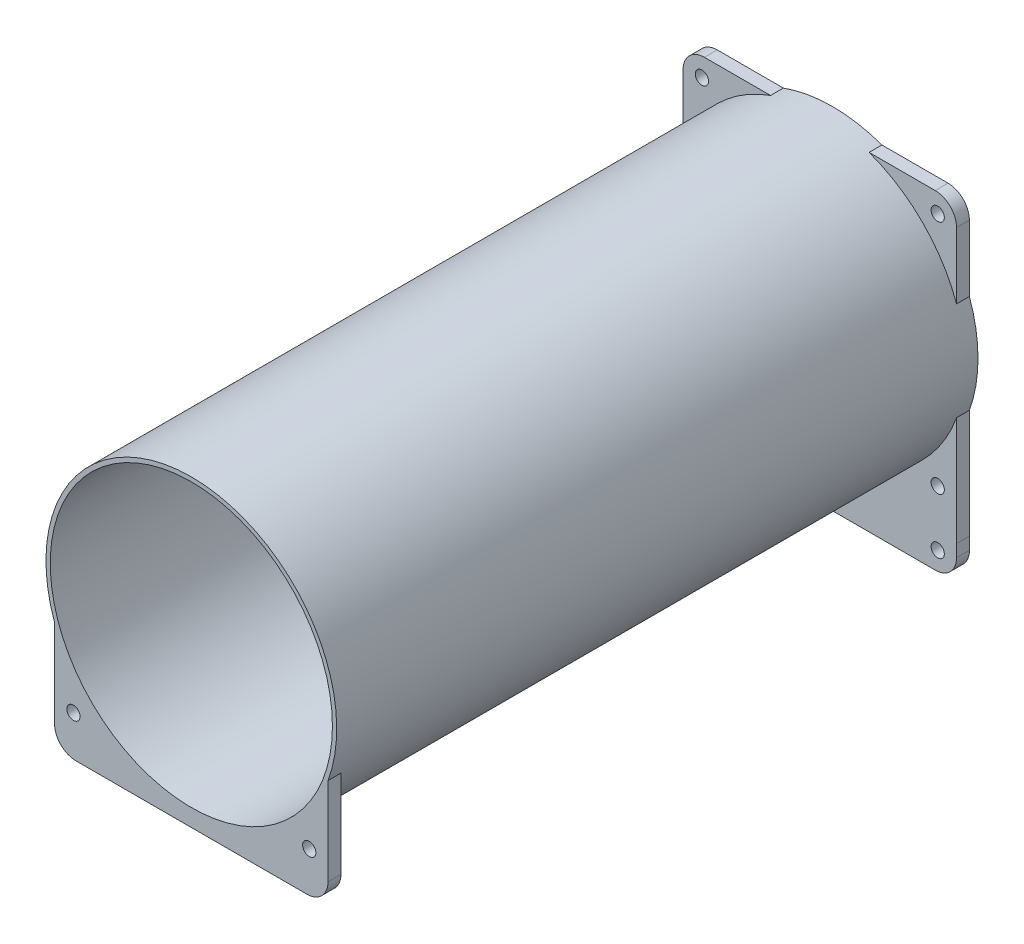
ISO-10303-21;
HEADER;
FILE_DESCRIPTION(('STEP AP214'),'2;1');
FILE_NAME('part.step','',(''),(''),'','','');
FILE_SCHEMA(('AUTOMOTIVE_DESIGN { 1 0 10303 214 1 1 1 1 }'));
ENDSEC;
DATA;
#1=APPLICATION_CONTEXT('core data for automotive mechanical design processes');
#2=APPLICATION_PROTOCOL_DEFINITION('international standard','automotive_design',2000,#1);
#3=PRODUCT_CONTEXT('',#1,'mechanical');
#4=PRODUCT('Part','Part','',(#3));
#5=PRODUCT_RELATED_PRODUCT_CATEGORY('part','',(#4));
#6=PRODUCT_DEFINITION_FORMATION('','',#4);
#7=PRODUCT_DEFINITION_CONTEXT('part definition',#1,'design');
#8=PRODUCT_DEFINITION('design','',#6,#7);
#9=PRODUCT_DEFINITION_SHAPE('','',#8);
#10=(LENGTH_UNIT() NAMED_UNIT(*) SI_UNIT(.MILLI.,.METRE.));
#11=(NAMED_UNIT(*) PLANE_ANGLE_UNIT() SI_UNIT($,.RADIAN.));
#12=(NAMED_UNIT(*) SI_UNIT($,.STERADIAN.) SOLID_ANGLE_UNIT());
#13=UNCERTAINTY_MEASURE_WITH_UNIT(LENGTH_MEASURE(1.E-05),#10,'distance_accuracy_value','');
#14=(GEOMETRIC_REPRESENTATION_CONTEXT(3) GLOBAL_UNCERTAINTY_ASSIGNED_CONTEXT((#13)) GLOBAL_UNIT_ASSIGNED_CONTEXT((#10,
#11,#12)) REPRESENTATION_CONTEXT('',''));
#15=CARTESIAN_POINT('',(0.,0.,0.));
#16=DIRECTION('',(0.,0.,1.));
#17=DIRECTION('',(1.,0.,0.));
#18=AXIS2_PLACEMENT_3D('',#15,#16,#17);
#19=CARTESIAN_POINT('',(0.,0.,53.));
#20=DIRECTION('',(0.,0.,1.));
#21=DIRECTION('',(1.,0.,0.));
#22=AXIS2_PLACEMENT_3D('',#19,#20,#21);
#23=PLANE('',#22);
#24=CARTESIAN_POINT('',(-27.5771644662754,5.92268552968515,53.));
#25=DIRECTION('',(0.,0.,1.));
#26=DIRECTION('',(1.,0.,0.));
#27=AXIS2_PLACEMENT_3D('',#24,#25,#26);
#28=CIRCLE('',#27,1.55);
#29=CARTESIAN_POINT('',(-26.0271644662754,5.92268552968515,53.));
#30=VERTEX_POINT('',#29);
#31=EDGE_CURVE('E426',#30,#30,#28,.T.);
#32=ORIENTED_EDGE('',*,*,#31,.F.);
#33=EDGE_LOOP('',(#32));
#34=FACE_BOUND('',#33,.T.);
#35=CARTESIAN_POINT('',(27.5771644662753,5.92268552968515,53.));
#36=DIRECTION('',(0.,0.,1.));
#37=DIRECTION('',(1.,0.,0.));
#38=AXIS2_PLACEMENT_3D('',#35,#36,#37);
#39=CIRCLE('',#38,1.55);
#40=CARTESIAN_POINT('',(29.1271644662753,5.92268552968515,53.));
#41=VERTEX_POINT('',#40);
#42=EDGE_CURVE('E513',#41,#41,#39,.T.);
#43=ORIENTED_EDGE('',*,*,#42,.F.);
#44=EDGE_LOOP('',(#43));
#45=FACE_BOUND('',#44,.T.);
#46=CARTESIAN_POINT('',(27.5771644662754,18.9226855296851,53.));
#47=DIRECTION('',(0.,0.,1.));
#48=DIRECTION('',(1.,0.,0.));
#49=AXIS2_PLACEMENT_3D('',#46,#47,#48);
#50=CIRCLE('',#49,1.55000000001874);
#51=CARTESIAN_POINT('',(29.1271644662941,18.9226855296851,53.));
#52=VERTEX_POINT('',#51);
#53=EDGE_CURVE('E511',#52,#52,#50,.F.);
#54=ORIENTED_EDGE('',*,*,#53,.T.);
#55=EDGE_LOOP('',(#54));
#56=FACE_BOUND('',#55,.T.);
#57=CARTESIAN_POINT('',(-27.5771644662754,18.9226855296851,53.));
#58=DIRECTION('',(0.,0.,1.));
#59=DIRECTION('',(1.,0.,0.));
#60=AXIS2_PLACEMENT_3D('',#57,#58,#59);
#61=CIRCLE('',#60,1.55000000001874);
#62=CARTESIAN_POINT('',(-26.0271644662566,18.9226855296851,53.));
#63=VERTEX_POINT('',#62);
#64=EDGE_CURVE('E448',#63,#63,#61,.T.);
#65=ORIENTED_EDGE('',*,*,#64,.F.);
#66=EDGE_LOOP('',(#65));
#67=FACE_BOUND('',#66,.T.);
#68=DIRECTION('',(0.,1.,0.));
#69=VECTOR('',#68,1.);
#70=CARTESIAN_POINT('',(31.9864677492385,0.,53.));
#71=LINE('',#70,#69);
#72=CARTESIAN_POINT('',(31.9864677492385,9.47000000000177,53.));
#73=VERTEX_POINT('',#72);
#74=CARTESIAN_POINT('',(31.9864677492387,34.9731036671784,53.));
#75=VERTEX_POINT('',#74);
#76=EDGE_CURVE('E509',#73,#75,#71,.T.);
#77=ORIENTED_EDGE('',*,*,#76,.T.);
#78=CARTESIAN_POINT('',(0.,46.4998499959605,53.));
#79=DIRECTION('',(0.,0.,1.));
#80=DIRECTION('',(1.,0.,0.));
#81=AXIS2_PLACEMENT_3D('',#78,#79,#80);
#82=CIRCLE('',#81,34.000000000018);
#83=CARTESIAN_POINT('',(-31.9864677492399,34.9731036671778,53.));
#84=VERTEX_POINT('',#83);
#85=EDGE_CURVE('E482',#75,#84,#82,.F.);
#86=ORIENTED_EDGE('',*,*,#85,.T.);
#87=DIRECTION('',(0.,-1.,0.));
#88=VECTOR('',#87,1.);
#89=CARTESIAN_POINT('',(-31.9864677492374,-2.22528973877618E-12,53.));
#90=LINE('',#89,#88);
#91=CARTESIAN_POINT('',(-31.9864677492388,9.47000000000005,53.));
#92=VERTEX_POINT('',#91);
#93=EDGE_CURVE('E491',#84,#92,#90,.T.);
#94=ORIENTED_EDGE('',*,*,#93,.T.);
#95=DIRECTION('',(-0.00171947023591037,-0.999998521709961,0.));
#96=VECTOR('',#95,1.);
#97=CARTESIAN_POINT('',(-32.0026565378179,0.0550276967337361,53.));
#98=LINE('',#97,#96);
#99=CARTESIAN_POINT('',(-31.9913878531997,6.60859735117958,53.));
#100=VERTEX_POINT('',#99);
#101=EDGE_CURVE('E494',#92,#100,#98,.T.);
#102=ORIENTED_EDGE('',*,*,#101,.T.);
#103=CARTESIAN_POINT('',(-26.9913952446499,6.59999999999999,53.));
#104=DIRECTION('',(0.,0.,1.));
#105=DIRECTION('',(1.,0.,0.));
#106=AXIS2_PLACEMENT_3D('',#103,#104,#105);
#107=CIRCLE('',#106,5.);
#108=CARTESIAN_POINT('',(-26.9913952446499,1.59999999999999,53.));
#109=VERTEX_POINT('',#108);
#110=EDGE_CURVE('E497',#100,#109,#107,.T.);
#111=ORIENTED_EDGE('',*,*,#110,.T.);
#112=DIRECTION('',(1.,0.,0.));
#113=VECTOR('',#112,1.);
#114=CARTESIAN_POINT('',(0.,1.59999999999999,53.));
#115=LINE('',#114,#113);
#116=CARTESIAN_POINT('',(26.9913952446497,1.6,53.));
#117=VERTEX_POINT('',#116);
#118=EDGE_CURVE('E500',#109,#117,#115,.T.);
#119=ORIENTED_EDGE('',*,*,#118,.T.);
#120=CARTESIAN_POINT('',(26.9913952446498,6.60000000000001,53.));
#121=DIRECTION('',(0.,0.,1.));
#122=DIRECTION('',(1.,0.,0.));
#123=AXIS2_PLACEMENT_3D('',#120,#121,#122);
#124=CIRCLE('',#123,5.);
#125=CARTESIAN_POINT('',(31.9913878531996,6.60859735117976,53.));
#126=VERTEX_POINT('',#125);
#127=EDGE_CURVE('E503',#117,#126,#124,.T.);
#128=ORIENTED_EDGE('',*,*,#127,.T.);
#129=DIRECTION('',(-0.00171947023594339,0.999998521709961,0.));
#130=VECTOR('',#129,1.);
#131=CARTESIAN_POINT('',(32.002656537818,0.0550276967347931,53.));
#132=LINE('',#131,#130);
#133=EDGE_CURVE('E506',#126,#73,#132,.T.);
#134=ORIENTED_EDGE('',*,*,#133,.T.);
#135=EDGE_LOOP('',(#77,#86,#94,#102,#111,#119,#128,#134));
#136=FACE_BOUND('',#135,.T.);
#137=ADVANCED_FACE('F168',(#34,#45,#56,#67,#136),#23,.T.);
#138=CARTESIAN_POINT('',(-27.5771644662754,74.0770144622359,53.));
#139=DIRECTION('',(0.,0.,1.));
#140=DIRECTION('',(1.,0.,0.));
#141=AXIS2_PLACEMENT_3D('',#138,#139,#140);
#142=CIRCLE('',#141,1.550000000018);
#143=CARTESIAN_POINT('',(-26.0271644662574,74.0770144622359,53.));
#144=VERTEX_POINT('',#143);
#145=EDGE_CURVE('E337',#144,#144,#142,.T.);
#146=ORIENTED_EDGE('',*,*,#145,.F.);
#147=EDGE_LOOP('',(#146));
#148=FACE_BOUND('',#147,.T.);
#149=DIRECTION('',(0.,-1.,0.));
#150=VECTOR('',#149,1.);
#151=CARTESIAN_POINT('',(-31.9864677492391,0.,53.));
#152=LINE('',#151,#150);
#153=CARTESIAN_POINT('',(-31.9864677492392,73.4863177451992,53.));
#154=VERTEX_POINT('',#153);
#155=CARTESIAN_POINT('',(-31.9864677492392,58.0265963247457,53.));
#156=VERTEX_POINT('',#155);
#157=EDGE_CURVE('E329',#154,#156,#152,.T.);
#158=ORIENTED_EDGE('',*,*,#157,.T.);
#159=CARTESIAN_POINT('',(-11.5267463287834,78.4863177451994,53.));
#160=VERTEX_POINT('',#159);
#161=EDGE_CURVE('E479',#156,#160,#82,.F.);
#162=ORIENTED_EDGE('',*,*,#161,.T.);
#163=DIRECTION('',(1.,0.,0.));
#164=VECTOR('',#163,1.);
#165=CARTESIAN_POINT('',(4.5091274135626E-12,78.4863177451988,53.));
#166=LINE('',#165,#164);
#167=CARTESIAN_POINT('',(-26.986467749238,78.4863177452003,53.));
#168=VERTEX_POINT('',#167);
#169=EDGE_CURVE('E469',#168,#160,#166,.T.);
#170=ORIENTED_EDGE('',*,*,#169,.F.);
#171=CARTESIAN_POINT('',(-26.9864677492379,73.4863177451994,53.));
#172=DIRECTION('',(0.,0.,1.));
#173=DIRECTION('',(1.,0.,0.));
#174=AXIS2_PLACEMENT_3D('',#171,#172,#173);
#175=CIRCLE('',#174,5.00000000000109);
#176=EDGE_CURVE('E471',#168,#154,#175,.T.);
#177=ORIENTED_EDGE('',*,*,#176,.T.);
#178=EDGE_LOOP('',(#158,#162,#170,#177));
#179=FACE_BOUND('',#178,.T.);
#180=ADVANCED_FACE('F377',(#148,#179),#23,.T.);
#181=CARTESIAN_POINT('',(27.5771644662754,74.0770144622359,53.));
#182=DIRECTION('',(0.,0.,1.));
#183=DIRECTION('',(1.,0.,0.));
#184=AXIS2_PLACEMENT_3D('',#181,#182,#183);
#185=CIRCLE('',#184,1.550000000018);
#186=CARTESIAN_POINT('',(29.1271644662934,74.0770144622359,53.));
#187=VERTEX_POINT('',#186);
#188=EDGE_CURVE('E286',#187,#187,#185,.F.);
#189=ORIENTED_EDGE('',*,*,#188,.T.);
#190=EDGE_LOOP('',(#189));
#191=FACE_BOUND('',#190,.T.);
#192=DIRECTION('',(1.,0.,0.));
#193=VECTOR('',#192,1.);
#194=CARTESIAN_POINT('',(1.76137789592298E-12,78.4863177451996,53.));
#195=LINE('',#194,#193);
#196=CARTESIAN_POINT('',(11.5267463287837,78.4863177451993,53.));
#197=VERTEX_POINT('',#196);
#198=CARTESIAN_POINT('',(26.9864677492376,78.486317745199,53.));
#199=VERTEX_POINT('',#198);
#200=EDGE_CURVE('E352',#197,#199,#195,.T.);
#201=ORIENTED_EDGE('',*,*,#200,.F.);
#202=CARTESIAN_POINT('',(31.986467749239,58.0265963247438,53.));
#203=VERTEX_POINT('',#202);
#204=EDGE_CURVE('E280',#197,#203,#82,.F.);
#205=ORIENTED_EDGE('',*,*,#204,.T.);
#206=DIRECTION('',(0.,-1.,0.));
#207=VECTOR('',#206,1.);
#208=CARTESIAN_POINT('',(31.9864677492407,9.61899435470919E-13,53.));
#209=LINE('',#208,#207);
#210=CARTESIAN_POINT('',(31.9864677492385,73.4863177451979,53.));
#211=VERTEX_POINT('',#210);
#212=EDGE_CURVE('E307',#211,#203,#209,.T.);
#213=ORIENTED_EDGE('',*,*,#212,.F.);
#214=CARTESIAN_POINT('',(26.986467749238,73.4863177451985,53.));
#215=DIRECTION('',(0.,0.,1.));
#216=DIRECTION('',(1.,0.,0.));
#217=AXIS2_PLACEMENT_3D('',#214,#215,#216);
#218=CIRCLE('',#217,5.00000000000053);
#219=EDGE_CURVE('E349',#199,#211,#218,.F.);
#220=ORIENTED_EDGE('',*,*,#219,.F.);
#221=EDGE_LOOP('',(#201,#205,#213,#220));
#222=FACE_BOUND('',#221,.T.);
#223=ADVANCED_FACE('F360',(#191,#222),#23,.T.);
#224=CARTESIAN_POINT('',(-27.5771644662754,5.92268552968515,53.));
#225=DIRECTION('',(0.,0.,-1.));
#226=DIRECTION('',(-1.,0.,0.));
#227=AXIS2_PLACEMENT_3D('',#224,#225,#226);
#228=CYLINDRICAL_SURFACE('',#227,1.55);
#229=ORIENTED_EDGE('',*,*,#31,.T.);
#230=EDGE_LOOP('',(#229));
#231=FACE_BOUND('',#230,.T.);
#232=CARTESIAN_POINT('',(-27.5771644662754,5.92268552968515,50.));
#233=DIRECTION('',(0.,0.,1.));
#234=DIRECTION('',(1.,0.,0.));
#235=AXIS2_PLACEMENT_3D('',#232,#233,#234);
#236=CIRCLE('',#235,1.55);
#237=CARTESIAN_POINT('',(-26.0271644662754,5.92268552968515,50.));
#238=VERTEX_POINT('',#237);
#239=EDGE_CURVE('E408',#238,#238,#236,.T.);
#240=ORIENTED_EDGE('',*,*,#239,.F.);
#241=EDGE_LOOP('',(#240));
#242=FACE_BOUND('',#241,.T.);
#243=ADVANCED_FACE('F389',(#231,#242),#228,.F.);
#244=CARTESIAN_POINT('',(27.5771644662753,5.92268552968515,53.));
#245=DIRECTION('',(0.,0.,-1.));
#246=DIRECTION('',(-1.,0.,0.));
#247=AXIS2_PLACEMENT_3D('',#244,#245,#246);
#248=CYLINDRICAL_SURFACE('',#247,1.55);
#249=ORIENTED_EDGE('',*,*,#42,.T.);
#250=EDGE_LOOP('',(#249));
#251=FACE_BOUND('',#250,.T.);
#252=CARTESIAN_POINT('',(27.5771644662753,5.92268552968515,50.));
#253=DIRECTION('',(0.,0.,1.));
#254=DIRECTION('',(1.,0.,0.));
#255=AXIS2_PLACEMENT_3D('',#252,#253,#254);
#256=CIRCLE('',#255,1.55);
#257=CARTESIAN_POINT('',(29.1271644662753,5.92268552968515,50.));
#258=VERTEX_POINT('',#257);
#259=EDGE_CURVE('E412',#258,#258,#256,.T.);
#260=ORIENTED_EDGE('',*,*,#259,.F.);
#261=EDGE_LOOP('',(#260));
#262=FACE_BOUND('',#261,.T.);
#263=ADVANCED_FACE('F394',(#251,#262),#248,.F.);
#264=CARTESIAN_POINT('',(27.5771644662754,18.9226855296851,53.));
#265=DIRECTION('',(0.,0.,-1.));
#266=DIRECTION('',(-1.,0.,0.));
#267=AXIS2_PLACEMENT_3D('',#264,#265,#266);
#268=CYLINDRICAL_SURFACE('',#267,1.55000000001874);
#269=ORIENTED_EDGE('',*,*,#53,.F.);
#270=EDGE_LOOP('',(#269));
#271=FACE_BOUND('',#270,.T.);
#272=CARTESIAN_POINT('',(27.5771644662754,18.9226855296851,50.));
#273=DIRECTION('',(0.,0.,1.));
#274=DIRECTION('',(1.,0.,0.));
#275=AXIS2_PLACEMENT_3D('',#272,#273,#274);
#276=CIRCLE('',#275,1.55000000001874);
#277=CARTESIAN_POINT('',(29.1271644662941,18.9226855296851,50.));
#278=VERTEX_POINT('',#277);
#279=EDGE_CURVE('E416',#278,#278,#276,.F.);
#280=ORIENTED_EDGE('',*,*,#279,.T.);
#281=EDGE_LOOP('',(#280));
#282=FACE_BOUND('',#281,.T.);
#283=ADVANCED_FACE('F567',(#271,#282),#268,.F.);
#284=CARTESIAN_POINT('',(-31.9864677492374,-2.22528973877618E-12,53.));
#285=DIRECTION('',(1.,0.,0.));
#286=DIRECTION('',(0.,1.,0.));
#287=AXIS2_PLACEMENT_3D('',#284,#285,#286);
#288=PLANE('',#287);
#289=DIRECTION('',(0.,-1.,0.));
#290=VECTOR('',#289,1.);
#291=CARTESIAN_POINT('',(-31.9864677492374,-2.22528973877618E-12,50.));
#292=LINE('',#291,#290);
#293=CARTESIAN_POINT('',(-31.9864677492399,34.9731036671778,50.));
#294=VERTEX_POINT('',#293);
#295=CARTESIAN_POINT('',(-31.9864677492388,9.47000000000005,50.));
#296=VERTEX_POINT('',#295);
#297=EDGE_CURVE('E420',#294,#296,#292,.T.);
#298=ORIENTED_EDGE('',*,*,#297,.T.);
#299=DIRECTION('',(0.,0.,-1.));
#300=VECTOR('',#299,1.);
#301=CARTESIAN_POINT('',(-31.9864677492388,9.47000000000005,53.));
#302=LINE('',#301,#300);
#303=EDGE_CURVE('E177',#92,#296,#302,.T.);
#304=ORIENTED_EDGE('',*,*,#303,.F.);
#305=ORIENTED_EDGE('',*,*,#93,.F.);
#306=DIRECTION('',(0.,0.,-1.));
#307=VECTOR('',#306,1.);
#308=CARTESIAN_POINT('',(-31.9864677492399,34.9731036671778,53.));
#309=LINE('',#308,#307);
#310=EDGE_CURVE('E12',#84,#294,#309,.T.);
#311=ORIENTED_EDGE('',*,*,#310,.T.);
#312=EDGE_LOOP('',(#298,#304,#305,#311));
#313=FACE_BOUND('',#312,.T.);
#314=ADVANCED_FACE('F535',(#313),#288,.F.);
#315=CARTESIAN_POINT('',(-32.0026565378179,0.0550276967337361,53.));
#316=DIRECTION('',(0.999998521709961,-0.00171947023591036,0.));
#317=DIRECTION('',(0.00171947023591037,0.999998521709961,0.));
#318=AXIS2_PLACEMENT_3D('',#315,#316,#317);
#319=PLANE('',#318);
#320=DIRECTION('',(-0.00171947023591037,-0.999998521709961,0.));
#321=VECTOR('',#320,1.);
#322=CARTESIAN_POINT('',(-32.0026565378179,0.0550276967337361,50.));
#323=LINE('',#322,#321);
#324=CARTESIAN_POINT('',(-31.9913878531997,6.60859735117958,50.));
#325=VERTEX_POINT('',#324);
#326=EDGE_CURVE('E423',#296,#325,#323,.T.);
#327=ORIENTED_EDGE('',*,*,#326,.T.);
#328=DIRECTION('',(0.,0.,-1.));
#329=VECTOR('',#328,1.);
#330=CARTESIAN_POINT('',(-31.9913878531997,6.60859735117958,53.));
#331=LINE('',#330,#329);
#332=EDGE_CURVE('E462',#100,#325,#331,.T.);
#333=ORIENTED_EDGE('',*,*,#332,.F.);
#334=ORIENTED_EDGE('',*,*,#101,.F.);
#335=ORIENTED_EDGE('',*,*,#303,.T.);
#336=EDGE_LOOP('',(#327,#333,#334,#335));
#337=FACE_BOUND('',#336,.T.);
#338=ADVANCED_FACE('F579',(#337),#319,.F.);
#339=CARTESIAN_POINT('',(-26.9913952446499,6.59999999999999,53.));
#340=DIRECTION('',(0.,0.,-1.));
#341=DIRECTION('',(-1.,0.,0.));
#342=AXIS2_PLACEMENT_3D('',#339,#340,#341);
#343=CYLINDRICAL_SURFACE('',#342,5.);
#344=CARTESIAN_POINT('',(-26.9913952446499,6.59999999999999,50.));
#345=DIRECTION('',(0.,0.,1.));
#346=DIRECTION('',(1.,0.,0.));
#347=AXIS2_PLACEMENT_3D('',#344,#345,#346);
#348=CIRCLE('',#347,5.);
#349=CARTESIAN_POINT('',(-26.9913952446499,1.59999999999999,50.));
#350=VERTEX_POINT('',#349);
#351=EDGE_CURVE('E431',#325,#350,#348,.T.);
#352=ORIENTED_EDGE('',*,*,#351,.T.);
#353=DIRECTION('',(0.,0.,-1.));
#354=VECTOR('',#353,1.);
#355=CARTESIAN_POINT('',(-26.9913952446499,1.59999999999999,53.));
#356=LINE('',#355,#354);
#357=EDGE_CURVE('E459',#109,#350,#356,.T.);
#358=ORIENTED_EDGE('',*,*,#357,.F.);
#359=ORIENTED_EDGE('',*,*,#110,.F.);
#360=ORIENTED_EDGE('',*,*,#332,.T.);
#361=EDGE_LOOP('',(#352,#358,#359,#360));
#362=FACE_BOUND('',#361,.T.);
#363=ADVANCED_FACE('F575',(#362),#343,.T.);
#364=CARTESIAN_POINT('',(0.,1.59999999999999,53.));
#365=DIRECTION('',(0.,1.,0.));
#366=DIRECTION('',(-1.,0.,0.));
#367=AXIS2_PLACEMENT_3D('',#364,#365,#366);
#368=PLANE('',#367);
#369=DIRECTION('',(1.,0.,0.));
#370=VECTOR('',#369,1.);
#371=CARTESIAN_POINT('',(0.,1.59999999999999,50.));
#372=LINE('',#371,#370);
#373=CARTESIAN_POINT('',(26.9913952446497,1.6,50.));
#374=VERTEX_POINT('',#373);
#375=EDGE_CURVE('E434',#350,#374,#372,.T.);
#376=ORIENTED_EDGE('',*,*,#375,.T.);
#377=DIRECTION('',(0.,0.,-1.));
#378=VECTOR('',#377,1.);
#379=CARTESIAN_POINT('',(26.9913952446497,1.6,53.));
#380=LINE('',#379,#378);
#381=EDGE_CURVE('E456',#117,#374,#380,.T.);
#382=ORIENTED_EDGE('',*,*,#381,.F.);
#383=ORIENTED_EDGE('',*,*,#118,.F.);
#384=ORIENTED_EDGE('',*,*,#357,.T.);
#385=EDGE_LOOP('',(#376,#382,#383,#384));
#386=FACE_BOUND('',#385,.T.);
#387=ADVANCED_FACE('F572',(#386),#368,.F.);
#388=CARTESIAN_POINT('',(26.9913952446498,6.60000000000001,53.));
#389=DIRECTION('',(0.,0.,-1.));
#390=DIRECTION('',(-1.,0.,0.));
#391=AXIS2_PLACEMENT_3D('',#388,#389,#390);
#392=CYLINDRICAL_SURFACE('',#391,5.);
#393=CARTESIAN_POINT('',(26.9913952446498,6.60000000000001,50.));
#394=DIRECTION('',(0.,0.,1.));
#395=DIRECTION('',(1.,0.,0.));
#396=AXIS2_PLACEMENT_3D('',#393,#394,#395);
#397=CIRCLE('',#396,5.);
#398=CARTESIAN_POINT('',(31.9913878531996,6.60859735117976,50.));
#399=VERTEX_POINT('',#398);
#400=EDGE_CURVE('E437',#374,#399,#397,.T.);
#401=ORIENTED_EDGE('',*,*,#400,.T.);
#402=DIRECTION('',(0.,0.,-1.));
#403=VECTOR('',#402,1.);
#404=CARTESIAN_POINT('',(31.9913878531996,6.60859735117976,53.));
#405=LINE('',#404,#403);
#406=EDGE_CURVE('E453',#126,#399,#405,.T.);
#407=ORIENTED_EDGE('',*,*,#406,.F.);
#408=ORIENTED_EDGE('',*,*,#127,.F.);
#409=ORIENTED_EDGE('',*,*,#381,.T.);
#410=EDGE_LOOP('',(#401,#407,#408,#409));
#411=FACE_BOUND('',#410,.T.);
#412=ADVANCED_FACE('F555',(#411),#392,.T.);
#413=CARTESIAN_POINT('',(32.002656537818,0.0550276967347931,53.));
#414=DIRECTION('',(-0.999998521709961,-0.00171947023594339,0.));
#415=DIRECTION('',(0.00171947023594339,-0.999998521709961,0.));
#416=AXIS2_PLACEMENT_3D('',#413,#414,#415);
#417=PLANE('',#416);
#418=DIRECTION('',(-0.00171947023594339,0.999998521709961,0.));
#419=VECTOR('',#418,1.);
#420=CARTESIAN_POINT('',(32.002656537818,0.0550276967347931,50.));
#421=LINE('',#420,#419);
#422=CARTESIAN_POINT('',(31.9864677492385,9.47000000000177,50.));
#423=VERTEX_POINT('',#422);
#424=EDGE_CURVE('E440',#399,#423,#421,.T.);
#425=ORIENTED_EDGE('',*,*,#424,.T.);
#426=DIRECTION('',(0.,0.,-1.));
#427=VECTOR('',#426,1.);
#428=CARTESIAN_POINT('',(31.9864677492385,9.47000000000177,53.));
#429=LINE('',#428,#427);
#430=EDGE_CURVE('E450',#73,#423,#429,.T.);
#431=ORIENTED_EDGE('',*,*,#430,.F.);
#432=ORIENTED_EDGE('',*,*,#133,.F.);
#433=ORIENTED_EDGE('',*,*,#406,.T.);
#434=EDGE_LOOP('',(#425,#431,#432,#433));
#435=FACE_BOUND('',#434,.T.);
#436=ADVANCED_FACE('F551',(#435),#417,.F.);
#437=CARTESIAN_POINT('',(31.9864677492385,0.,53.));
#438=DIRECTION('',(-1.,0.,0.));
#439=DIRECTION('',(0.,0.,1.));
#440=AXIS2_PLACEMENT_3D('',#437,#438,#439);
#441=PLANE('',#440);
#442=DIRECTION('',(0.,1.,0.));
#443=VECTOR('',#442,1.);
#444=CARTESIAN_POINT('',(31.9864677492385,0.,50.));
#445=LINE('',#444,#443);
#446=CARTESIAN_POINT('',(31.9864677492387,34.9731036671784,50.));
#447=VERTEX_POINT('',#446);
#448=EDGE_CURVE('E443',#423,#447,#445,.T.);
#449=ORIENTED_EDGE('',*,*,#448,.T.);
#450=DIRECTION('',(0.,0.,-1.));
#451=VECTOR('',#450,1.);
#452=CARTESIAN_POINT('',(31.9864677492387,34.9731036671784,53.));
#453=LINE('',#452,#451);
#454=EDGE_CURVE('E194',#75,#447,#453,.T.);
#455=ORIENTED_EDGE('',*,*,#454,.F.);
#456=ORIENTED_EDGE('',*,*,#76,.F.);
#457=ORIENTED_EDGE('',*,*,#430,.T.);
#458=EDGE_LOOP('',(#449,#455,#456,#457));
#459=FACE_BOUND('',#458,.T.);
#460=ADVANCED_FACE('F556',(#459),#441,.F.);
#461=CARTESIAN_POINT('',(-27.5771644662754,18.9226855296851,53.));
#462=DIRECTION('',(0.,0.,-1.));
#463=DIRECTION('',(-1.,0.,0.));
#464=AXIS2_PLACEMENT_3D('',#461,#462,#463);
#465=CYLINDRICAL_SURFACE('',#464,1.55000000001874);
#466=ORIENTED_EDGE('',*,*,#64,.T.);
#467=EDGE_LOOP('',(#466));
#468=FACE_BOUND('',#467,.T.);
#469=CARTESIAN_POINT('',(-27.5771644662754,18.9226855296851,50.));
#470=DIRECTION('',(0.,0.,1.));
#471=DIRECTION('',(1.,0.,0.));
#472=AXIS2_PLACEMENT_3D('',#469,#470,#471);
#473=CIRCLE('',#472,1.55000000001874);
#474=CARTESIAN_POINT('',(-26.0271644662566,18.9226855296851,50.));
#475=VERTEX_POINT('',#474);
#476=EDGE_CURVE('E347',#475,#475,#473,.T.);
#477=ORIENTED_EDGE('',*,*,#476,.F.);
#478=EDGE_LOOP('',(#477));
#479=FACE_BOUND('',#478,.T.);
#480=ADVANCED_FACE('F403',(#468,#479),#465,.F.);
#481=CARTESIAN_POINT('',(0.,0.,50.));
#482=DIRECTION('',(0.,0.,1.));
#483=DIRECTION('',(1.,0.,0.));
#484=AXIS2_PLACEMENT_3D('',#481,#482,#483);
#485=PLANE('',#484);
#486=CARTESIAN_POINT('',(0.,46.4998499959605,50.));
#487=DIRECTION('',(0.,0.,1.));
#488=DIRECTION('',(1.,0.,0.));
#489=AXIS2_PLACEMENT_3D('',#486,#487,#488);
#490=CIRCLE('',#489,34.000000000018);
#491=CARTESIAN_POINT('',(31.986467749239,58.0265963247432,50.));
#492=VERTEX_POINT('',#491);
#493=EDGE_CURVE('E300',#447,#492,#490,.T.);
#494=ORIENTED_EDGE('',*,*,#493,.F.);
#495=ORIENTED_EDGE('',*,*,#448,.F.);
#496=ORIENTED_EDGE('',*,*,#424,.F.);
#497=ORIENTED_EDGE('',*,*,#400,.F.);
#498=ORIENTED_EDGE('',*,*,#375,.F.);
#499=ORIENTED_EDGE('',*,*,#351,.F.);
#500=ORIENTED_EDGE('',*,*,#326,.F.);
#501=ORIENTED_EDGE('',*,*,#297,.F.);
#502=CARTESIAN_POINT('',(-31.9864677492392,58.0265963247457,50.));
#503=VERTEX_POINT('',#502);
#504=EDGE_CURVE('E299',#503,#294,#490,.T.);
#505=ORIENTED_EDGE('',*,*,#504,.F.);
#506=DIRECTION('',(0.,-1.,0.));
#507=VECTOR('',#506,1.);
#508=CARTESIAN_POINT('',(-31.9864677492391,0.,50.));
#509=LINE('',#508,#507);
#510=CARTESIAN_POINT('',(-31.9864677492392,73.4863177451992,50.));
#511=VERTEX_POINT('',#510);
#512=EDGE_CURVE('E334',#511,#503,#509,.T.);
#513=ORIENTED_EDGE('',*,*,#512,.F.);
#514=CARTESIAN_POINT('',(-26.9864677492379,73.4863177451994,50.));
#515=DIRECTION('',(0.,0.,1.));
#516=DIRECTION('',(1.,0.,0.));
#517=AXIS2_PLACEMENT_3D('',#514,#515,#516);
#518=CIRCLE('',#517,5.00000000000109);
#519=CARTESIAN_POINT('',(-26.986467749238,78.4863177452003,50.));
#520=VERTEX_POINT('',#519);
#521=EDGE_CURVE('E326',#520,#511,#518,.T.);
#522=ORIENTED_EDGE('',*,*,#521,.F.);
#523=DIRECTION('',(1.,0.,0.));
#524=VECTOR('',#523,1.);
#525=CARTESIAN_POINT('',(4.5091274135626E-12,78.4863177451988,50.));
#526=LINE('',#525,#524);
#527=CARTESIAN_POINT('',(-11.5267463287834,78.4863177451994,50.));
#528=VERTEX_POINT('',#527);
#529=EDGE_CURVE('E297',#520,#528,#526,.T.);
#530=ORIENTED_EDGE('',*,*,#529,.T.);
#531=CARTESIAN_POINT('',(11.5267463287837,78.4863177451993,50.));
#532=VERTEX_POINT('',#531);
#533=EDGE_CURVE('E276',#532,#528,#490,.T.);
#534=ORIENTED_EDGE('',*,*,#533,.F.);
#535=DIRECTION('',(1.,0.,0.));
#536=VECTOR('',#535,1.);
#537=CARTESIAN_POINT('',(1.76137789592298E-12,78.4863177451996,50.));
#538=LINE('',#537,#536);
#539=CARTESIAN_POINT('',(26.9864677492376,78.486317745199,50.));
#540=VERTEX_POINT('',#539);
#541=EDGE_CURVE('E294',#532,#540,#538,.T.);
#542=ORIENTED_EDGE('',*,*,#541,.T.);
#543=CARTESIAN_POINT('',(26.986467749238,73.4863177451985,50.));
#544=DIRECTION('',(0.,0.,1.));
#545=DIRECTION('',(1.,0.,0.));
#546=AXIS2_PLACEMENT_3D('',#543,#544,#545);
#547=CIRCLE('',#546,5.00000000000053);
#548=CARTESIAN_POINT('',(31.9864677492385,73.4863177451979,50.));
#549=VERTEX_POINT('',#548);
#550=EDGE_CURVE('E304',#540,#549,#547,.F.);
#551=ORIENTED_EDGE('',*,*,#550,.T.);
#552=DIRECTION('',(0.,-1.,0.));
#553=VECTOR('',#552,1.);
#554=CARTESIAN_POINT('',(31.9864677492407,9.61899435470919E-13,50.));
#555=LINE('',#554,#553);
#556=EDGE_CURVE('E298',#549,#492,#555,.T.);
#557=ORIENTED_EDGE('',*,*,#556,.T.);
#558=EDGE_LOOP('',(#494,#495,#496,#497,#498,#499,#500,#501,#505,#513,#522,#530,#534,#542,#551,#557));
#559=FACE_BOUND('',#558,.T.);
#560=CARTESIAN_POINT('',(0.,46.4998499959605,50.));
#561=DIRECTION('',(0.,0.,1.));
#562=DIRECTION('',(1.,0.,0.));
#563=AXIS2_PLACEMENT_3D('',#560,#561,#562);
#564=CIRCLE('',#563,33.000000000018);
#565=CARTESIAN_POINT('',(33.000000000018,46.4998499959605,50.));
#566=VERTEX_POINT('',#565);
#567=EDGE_CURVE('E172',#566,#566,#564,.T.);
#568=ORIENTED_EDGE('',*,*,#567,.T.);
#569=EDGE_LOOP('',(#568));
#570=FACE_BOUND('',#569,.T.);
#571=CARTESIAN_POINT('',(27.5771644662754,74.0770144622359,50.));
#572=DIRECTION('',(0.,0.,1.));
#573=DIRECTION('',(1.,0.,0.));
#574=AXIS2_PLACEMENT_3D('',#571,#572,#573);
#575=CIRCLE('',#574,1.550000000018);
#576=CARTESIAN_POINT('',(29.1271644662934,74.0770144622359,50.));
#577=VERTEX_POINT('',#576);
#578=EDGE_CURVE('E303',#577,#577,#575,.F.);
#579=ORIENTED_EDGE('',*,*,#578,.F.);
#580=EDGE_LOOP('',(#579));
#581=FACE_BOUND('',#580,.T.);
#582=CARTESIAN_POINT('',(-27.5771644662754,74.0770144622359,50.));
#583=DIRECTION('',(0.,0.,1.));
#584=DIRECTION('',(1.,0.,0.));
#585=AXIS2_PLACEMENT_3D('',#582,#583,#584);
#586=CIRCLE('',#585,1.550000000018);
#587=CARTESIAN_POINT('',(-26.0271644662574,74.0770144622359,50.));
#588=VERTEX_POINT('',#587);
#589=EDGE_CURVE('E317',#588,#588,#586,.T.);
#590=ORIENTED_EDGE('',*,*,#589,.T.);
#591=EDGE_LOOP('',(#590));
#592=FACE_BOUND('',#591,.T.);
#593=ORIENTED_EDGE('',*,*,#239,.T.);
#594=EDGE_LOOP('',(#593));
#595=FACE_BOUND('',#594,.T.);
#596=ORIENTED_EDGE('',*,*,#259,.T.);
#597=EDGE_LOOP('',(#596));
#598=FACE_BOUND('',#597,.T.);
#599=ORIENTED_EDGE('',*,*,#279,.F.);
#600=EDGE_LOOP('',(#599));
#601=FACE_BOUND('',#600,.T.);
#602=ORIENTED_EDGE('',*,*,#476,.T.);
#603=EDGE_LOOP('',(#602));
#604=FACE_BOUND('',#603,.T.);
#605=ADVANCED_FACE('F291',(#559,#570,#581,#592,#595,#598,#601,#604),#485,.F.);
#606=CARTESIAN_POINT('',(4.5091274135626E-12,78.4863177451988,53.));
#607=DIRECTION('',(0.,1.,0.));
#608=DIRECTION('',(-1.,0.,0.));
#609=AXIS2_PLACEMENT_3D('',#606,#607,#608);
#610=PLANE('',#609);
#611=ORIENTED_EDGE('',*,*,#529,.F.);
#612=DIRECTION('',(0.,0.,-1.));
#613=VECTOR('',#612,1.);
#614=CARTESIAN_POINT('',(-26.986467749238,78.4863177452003,53.));
#615=LINE('',#614,#613);
#616=EDGE_CURVE('E343',#168,#520,#615,.T.);
#617=ORIENTED_EDGE('',*,*,#616,.F.);
#618=ORIENTED_EDGE('',*,*,#169,.T.);
#619=DIRECTION('',(0.,0.,-1.));
#620=VECTOR('',#619,1.);
#621=CARTESIAN_POINT('',(-11.5267463287834,78.4863177451994,53.));
#622=LINE('',#621,#620);
#623=EDGE_CURVE('E345',#160,#528,#622,.T.);
#624=ORIENTED_EDGE('',*,*,#623,.T.);
#625=EDGE_LOOP('',(#611,#617,#618,#624));
#626=FACE_BOUND('',#625,.T.);
#627=ADVANCED_FACE('F402',(#626),#610,.T.);
#628=CARTESIAN_POINT('',(-26.9864677492379,73.4863177451994,53.));
#629=DIRECTION('',(0.,0.,-1.));
#630=DIRECTION('',(-1.,0.,0.));
#631=AXIS2_PLACEMENT_3D('',#628,#629,#630);
#632=CYLINDRICAL_SURFACE('',#631,5.00000000000109);
#633=ORIENTED_EDGE('',*,*,#521,.T.);
#634=DIRECTION('',(0.,0.,-1.));
#635=VECTOR('',#634,1.);
#636=CARTESIAN_POINT('',(-31.9864677492392,73.4863177451992,53.));
#637=LINE('',#636,#635);
#638=EDGE_CURVE('E340',#154,#511,#637,.T.);
#639=ORIENTED_EDGE('',*,*,#638,.F.);
#640=ORIENTED_EDGE('',*,*,#176,.F.);
#641=ORIENTED_EDGE('',*,*,#616,.T.);
#642=EDGE_LOOP('',(#633,#639,#640,#641));
#643=FACE_BOUND('',#642,.T.);
#644=ADVANCED_FACE('F587',(#643),#632,.T.);
#645=CARTESIAN_POINT('',(-27.5771644662754,74.0770144622359,53.));
#646=DIRECTION('',(0.,0.,-1.));
#647=DIRECTION('',(-1.,0.,0.));
#648=AXIS2_PLACEMENT_3D('',#645,#646,#647);
#649=CYLINDRICAL_SURFACE('',#648,1.550000000018);
#650=ORIENTED_EDGE('',*,*,#145,.T.);
#651=EDGE_LOOP('',(#650));
#652=FACE_BOUND('',#651,.T.);
#653=ORIENTED_EDGE('',*,*,#589,.F.);
#654=EDGE_LOOP('',(#653));
#655=FACE_BOUND('',#654,.T.);
#656=ADVANCED_FACE('F371',(#652,#655),#649,.F.);
#657=CARTESIAN_POINT('',(27.5771644662754,74.0770144622359,53.));
#658=DIRECTION('',(0.,0.,-1.));
#659=DIRECTION('',(-1.,0.,0.));
#660=AXIS2_PLACEMENT_3D('',#657,#658,#659);
#661=CYLINDRICAL_SURFACE('',#660,1.550000000018);
#662=ORIENTED_EDGE('',*,*,#188,.F.);
#663=EDGE_LOOP('',(#662));
#664=FACE_BOUND('',#663,.T.);
#665=ORIENTED_EDGE('',*,*,#578,.T.);
#666=EDGE_LOOP('',(#665));
#667=FACE_BOUND('',#666,.T.);
#668=ADVANCED_FACE('F363',(#664,#667),#661,.F.);
#669=CARTESIAN_POINT('',(26.986467749238,73.4863177451985,53.));
#670=DIRECTION('',(0.,0.,-1.));
#671=DIRECTION('',(-1.,0.,0.));
#672=AXIS2_PLACEMENT_3D('',#669,#670,#671);
#673=CYLINDRICAL_SURFACE('',#672,5.00000000000053);
#674=ORIENTED_EDGE('',*,*,#550,.F.);
#675=DIRECTION('',(0.,0.,-1.));
#676=VECTOR('',#675,1.);
#677=CARTESIAN_POINT('',(26.9864677492376,78.486317745199,53.));
#678=LINE('',#677,#676);
#679=EDGE_CURVE('E285',#199,#540,#678,.T.);
#680=ORIENTED_EDGE('',*,*,#679,.F.);
#681=ORIENTED_EDGE('',*,*,#219,.T.);
#682=DIRECTION('',(0.,0.,-1.));
#683=VECTOR('',#682,1.);
#684=CARTESIAN_POINT('',(31.9864677492385,73.4863177451979,53.));
#685=LINE('',#684,#683);
#686=EDGE_CURVE('E313',#211,#549,#685,.T.);
#687=ORIENTED_EDGE('',*,*,#686,.T.);
#688=EDGE_LOOP('',(#674,#680,#681,#687));
#689=FACE_BOUND('',#688,.T.);
#690=ADVANCED_FACE('F361',(#689),#673,.T.);
#691=CARTESIAN_POINT('',(1.76137789592298E-12,78.4863177451996,53.));
#692=DIRECTION('',(0.,1.,0.));
#693=DIRECTION('',(-1.,0.,0.));
#694=AXIS2_PLACEMENT_3D('',#691,#692,#693);
#695=PLANE('',#694);
#696=ORIENTED_EDGE('',*,*,#541,.F.);
#697=DIRECTION('',(0.,0.,-1.));
#698=VECTOR('',#697,1.);
#699=CARTESIAN_POINT('',(11.5267463287837,78.4863177451993,53.));
#700=LINE('',#699,#698);
#701=EDGE_CURVE('E270',#197,#532,#700,.T.);
#702=ORIENTED_EDGE('',*,*,#701,.F.);
#703=ORIENTED_EDGE('',*,*,#200,.T.);
#704=ORIENTED_EDGE('',*,*,#679,.T.);
#705=EDGE_LOOP('',(#696,#702,#703,#704));
#706=FACE_BOUND('',#705,.T.);
#707=ADVANCED_FACE('F301',(#706),#695,.T.);
#708=CARTESIAN_POINT('',(-31.9864677492391,0.,53.));
#709=DIRECTION('',(1.,0.,0.));
#710=DIRECTION('',(0.,1.,0.));
#711=AXIS2_PLACEMENT_3D('',#708,#709,#710);
#712=PLANE('',#711);
#713=ORIENTED_EDGE('',*,*,#512,.T.);
#714=DIRECTION('',(0.,0.,-1.));
#715=VECTOR('',#714,1.);
#716=CARTESIAN_POINT('',(-31.9864677492392,58.0265963247457,53.));
#717=LINE('',#716,#715);
#718=EDGE_CURVE('E338',#156,#503,#717,.T.);
#719=ORIENTED_EDGE('',*,*,#718,.F.);
#720=ORIENTED_EDGE('',*,*,#157,.F.);
#721=ORIENTED_EDGE('',*,*,#638,.T.);
#722=EDGE_LOOP('',(#713,#719,#720,#721));
#723=FACE_BOUND('',#722,.T.);
#724=ADVANCED_FACE('F369',(#723),#712,.F.);
#725=CARTESIAN_POINT('',(31.9864677492407,9.61899435470919E-13,53.));
#726=DIRECTION('',(1.,0.,0.));
#727=DIRECTION('',(0.,1.,0.));
#728=AXIS2_PLACEMENT_3D('',#725,#726,#727);
#729=PLANE('',#728);
#730=ORIENTED_EDGE('',*,*,#556,.F.);
#731=ORIENTED_EDGE('',*,*,#686,.F.);
#732=ORIENTED_EDGE('',*,*,#212,.T.);
#733=DIRECTION('',(0.,0.,-1.));
#734=VECTOR('',#733,1.);
#735=CARTESIAN_POINT('',(31.986467749239,58.0265963247432,53.));
#736=LINE('',#735,#734);
#737=EDGE_CURVE('E315',#203,#492,#736,.T.);
#738=ORIENTED_EDGE('',*,*,#737,.T.);
#739=EDGE_LOOP('',(#730,#731,#732,#738));
#740=FACE_BOUND('',#739,.T.);
#741=ADVANCED_FACE('F355',(#740),#729,.T.);
#742=CARTESIAN_POINT('',(0.,46.4998499959605,53.));
#743=DIRECTION('',(0.,0.,-1.));
#744=DIRECTION('',(-1.,0.,0.));
#745=AXIS2_PLACEMENT_3D('',#742,#743,#744);
#746=CYLINDRICAL_SURFACE('',#745,33.000000000018);
#747=ORIENTED_EDGE('',*,*,#567,.F.);
#748=EDGE_LOOP('',(#747));
#749=FACE_BOUND('',#748,.T.);
#750=CARTESIAN_POINT('',(0.,46.4998499959605,200.));
#751=DIRECTION('',(0.,0.,1.));
#752=DIRECTION('',(1.,0.,0.));
#753=AXIS2_PLACEMENT_3D('',#750,#751,#752);
#754=CIRCLE('',#753,33.000000000018);
#755=CARTESIAN_POINT('',(33.000000000018,46.4998499959605,200.));
#756=VERTEX_POINT('',#755);
#757=EDGE_CURVE('E485',#756,#756,#754,.T.);
#758=ORIENTED_EDGE('',*,*,#757,.T.);
#759=EDGE_LOOP('',(#758));
#760=FACE_BOUND('',#759,.T.);
#761=ADVANCED_FACE('F170',(#749,#760),#746,.F.);
#762=CARTESIAN_POINT('',(0.,46.4998499959605,53.));
#763=DIRECTION('',(0.,0.,-1.));
#764=DIRECTION('',(-1.,0.,0.));
#765=AXIS2_PLACEMENT_3D('',#762,#763,#764);
#766=CYLINDRICAL_SURFACE('',#765,34.000000000018);
#767=ORIENTED_EDGE('',*,*,#504,.T.);
#768=ORIENTED_EDGE('',*,*,#310,.F.);
#769=ORIENTED_EDGE('',*,*,#85,.F.);
#770=ORIENTED_EDGE('',*,*,#454,.T.);
#771=ORIENTED_EDGE('',*,*,#493,.T.);
#772=ORIENTED_EDGE('',*,*,#737,.F.);
#773=ORIENTED_EDGE('',*,*,#204,.F.);
#774=ORIENTED_EDGE('',*,*,#701,.T.);
#775=ORIENTED_EDGE('',*,*,#533,.T.);
#776=ORIENTED_EDGE('',*,*,#623,.F.);
#777=ORIENTED_EDGE('',*,*,#161,.F.);
#778=ORIENTED_EDGE('',*,*,#718,.T.);
#779=EDGE_LOOP('',(#767,#768,#769,#770,#771,#772,#773,#774,#775,#776,#777,#778));
#780=FACE_BOUND('',#779,.T.);
#781=CARTESIAN_POINT('',(0.,46.4998499959605,197.));
#782=DIRECTION('',(0.,0.,1.));
#783=DIRECTION('',(1.,0.,0.));
#784=AXIS2_PLACEMENT_3D('',#781,#782,#783);
#785=CIRCLE('',#784,34.000000000018);
#786=CARTESIAN_POINT('',(-31.9864677492399,34.9731036671797,197.));
#787=VERTEX_POINT('',#786);
#788=CARTESIAN_POINT('',(31.9864677492387,34.9731036671765,197.));
#789=VERTEX_POINT('',#788);
#790=EDGE_CURVE('E825',#787,#789,#785,.T.);
#791=ORIENTED_EDGE('',*,*,#790,.F.);
#792=DIRECTION('',(0.,0.,1.));
#793=VECTOR('',#792,1.);
#794=CARTESIAN_POINT('',(-31.9864677492399,34.9731036671797,197.));
#795=LINE('',#794,#793);
#796=CARTESIAN_POINT('',(-31.9864677492399,34.9731036671797,200.));
#797=VERTEX_POINT('',#796);
#798=EDGE_CURVE('E839',#787,#797,#795,.T.);
#799=ORIENTED_EDGE('',*,*,#798,.T.);
#800=CARTESIAN_POINT('',(0.,46.4998499959605,200.));
#801=DIRECTION('',(0.,0.,1.));
#802=DIRECTION('',(1.,0.,0.));
#803=AXIS2_PLACEMENT_3D('',#800,#801,#802);
#804=CIRCLE('',#803,34.000000000018);
#805=CARTESIAN_POINT('',(31.9864677492387,34.9731036671765,200.));
#806=VERTEX_POINT('',#805);
#807=EDGE_CURVE('E870',#806,#797,#804,.T.);
#808=ORIENTED_EDGE('',*,*,#807,.F.);
#809=DIRECTION('',(0.,0.,1.));
#810=VECTOR('',#809,1.);
#811=CARTESIAN_POINT('',(31.9864677492387,34.9731036671765,197.));
#812=LINE('',#811,#810);
#813=EDGE_CURVE('E840',#789,#806,#812,.T.);
#814=ORIENTED_EDGE('',*,*,#813,.F.);
#815=EDGE_LOOP('',(#791,#799,#808,#814));
#816=FACE_BOUND('',#815,.T.);
#817=ADVANCED_FACE('F273',(#780,#816),#766,.T.);
#818=CARTESIAN_POINT('',(0.,46.4998499959605,200.));
#819=DIRECTION('',(0.,0.,1.));
#820=DIRECTION('',(1.,0.,0.));
#821=AXIS2_PLACEMENT_3D('',#818,#819,#820);
#822=PLANE('',#821);
#823=ORIENTED_EDGE('',*,*,#807,.T.);
#824=DIRECTION('',(0.,-1.,0.));
#825=VECTOR('',#824,1.);
#826=CARTESIAN_POINT('',(-31.9864677492384,-1.3531530986455E-12,200.));
#827=LINE('',#826,#825);
#828=CARTESIAN_POINT('',(-31.986467749239,14.4700000000016,200.));
#829=VERTEX_POINT('',#828);
#830=EDGE_CURVE('E856',#797,#829,#827,.T.);
#831=ORIENTED_EDGE('',*,*,#830,.T.);
#832=CARTESIAN_POINT('',(-26.986467749239,14.4700000000018,200.));
#833=DIRECTION('',(0.,0.,1.));
#834=DIRECTION('',(1.,0.,0.));
#835=AXIS2_PLACEMENT_3D('',#832,#833,#834);
#836=CIRCLE('',#835,5.);
#837=CARTESIAN_POINT('',(-26.986467749239,9.47000000000177,200.));
#838=VERTEX_POINT('',#837);
#839=EDGE_CURVE('E859',#829,#838,#836,.T.);
#840=ORIENTED_EDGE('',*,*,#839,.T.);
#841=DIRECTION('',(1.,0.,0.));
#842=VECTOR('',#841,1.);
#843=CARTESIAN_POINT('',(0.,9.47000000000177,200.));
#844=LINE('',#843,#842);
#845=CARTESIAN_POINT('',(26.9864677492386,9.47000000000177,200.));
#846=VERTEX_POINT('',#845);
#847=EDGE_CURVE('E862',#838,#846,#844,.T.);
#848=ORIENTED_EDGE('',*,*,#847,.T.);
#849=CARTESIAN_POINT('',(26.9864677492386,14.4700000000018,200.));
#850=DIRECTION('',(0.,0.,1.));
#851=DIRECTION('',(1.,0.,0.));
#852=AXIS2_PLACEMENT_3D('',#849,#850,#851);
#853=CIRCLE('',#852,5.);
#854=CARTESIAN_POINT('',(31.9864677492386,14.4700000000017,200.));
#855=VERTEX_POINT('',#854);
#856=EDGE_CURVE('E865',#855,#846,#853,.F.);
#857=ORIENTED_EDGE('',*,*,#856,.F.);
#858=DIRECTION('',(0.,1.,0.));
#859=VECTOR('',#858,1.);
#860=CARTESIAN_POINT('',(31.9864677492384,-2.48980170150767E-13,200.));
#861=LINE('',#860,#859);
#862=EDGE_CURVE('E185',#855,#806,#861,.T.);
#863=ORIENTED_EDGE('',*,*,#862,.T.);
#864=EDGE_LOOP('',(#823,#831,#840,#848,#857,#863));
#865=FACE_BOUND('',#864,.T.);
#866=ORIENTED_EDGE('',*,*,#757,.F.);
#867=EDGE_LOOP('',(#866));
#868=FACE_BOUND('',#867,.T.);
#869=CARTESIAN_POINT('',(27.5771644662754,18.9226855296851,200.));
#870=DIRECTION('',(0.,0.,1.));
#871=DIRECTION('',(1.,0.,0.));
#872=AXIS2_PLACEMENT_3D('',#869,#870,#871);
#873=CIRCLE('',#872,1.55000000001874);
#874=CARTESIAN_POINT('',(29.1271644662941,18.9226855296851,200.));
#875=VERTEX_POINT('',#874);
#876=EDGE_CURVE('E850',#875,#875,#873,.T.);
#877=ORIENTED_EDGE('',*,*,#876,.F.);
#878=EDGE_LOOP('',(#877));
#879=FACE_BOUND('',#878,.T.);
#880=CARTESIAN_POINT('',(-27.5771644662754,18.9226855296851,200.));
#881=DIRECTION('',(0.,0.,1.));
#882=DIRECTION('',(1.,0.,0.));
#883=AXIS2_PLACEMENT_3D('',#880,#881,#882);
#884=CIRCLE('',#883,1.55000000001874);
#885=CARTESIAN_POINT('',(-26.0271644662566,18.9226855296851,200.));
#886=VERTEX_POINT('',#885);
#887=EDGE_CURVE('E853',#886,#886,#884,.T.);
#888=ORIENTED_EDGE('',*,*,#887,.F.);
#889=EDGE_LOOP('',(#888));
#890=FACE_BOUND('',#889,.T.);
#891=ADVANCED_FACE('F690',(#865,#868,#879,#890),#822,.T.);
#892=CARTESIAN_POINT('',(-31.9864677492384,-1.3531530986455E-12,197.));
#893=DIRECTION('',(-1.,0.,0.));
#894=DIRECTION('',(0.,-1.,0.));
#895=AXIS2_PLACEMENT_3D('',#892,#893,#894);
#896=PLANE('',#895);
#897=ORIENTED_EDGE('',*,*,#830,.F.);
#898=ORIENTED_EDGE('',*,*,#798,.F.);
#899=DIRECTION('',(0.,-1.,0.));
#900=VECTOR('',#899,1.);
#901=CARTESIAN_POINT('',(-31.9864677492384,-1.3531530986455E-12,197.));
#902=LINE('',#901,#900);
#903=CARTESIAN_POINT('',(-31.986467749239,14.4700000000016,197.));
#904=VERTEX_POINT('',#903);
#905=EDGE_CURVE('E821',#787,#904,#902,.T.);
#906=ORIENTED_EDGE('',*,*,#905,.T.);
#907=DIRECTION('',(0.,0.,1.));
#908=VECTOR('',#907,1.);
#909=CARTESIAN_POINT('',(-31.986467749239,14.4700000000016,197.));
#910=LINE('',#909,#908);
#911=EDGE_CURVE('E841',#904,#829,#910,.T.);
#912=ORIENTED_EDGE('',*,*,#911,.T.);
#913=EDGE_LOOP('',(#897,#898,#906,#912));
#914=FACE_BOUND('',#913,.T.);
#915=ADVANCED_FACE('F707',(#914),#896,.T.);
#916=CARTESIAN_POINT('',(31.9864677492384,-2.48980170150767E-13,197.));
#917=DIRECTION('',(1.,0.,0.));
#918=DIRECTION('',(0.,1.,0.));
#919=AXIS2_PLACEMENT_3D('',#916,#917,#918);
#920=PLANE('',#919);
#921=ORIENTED_EDGE('',*,*,#862,.F.);
#922=DIRECTION('',(0.,0.,1.));
#923=VECTOR('',#922,1.);
#924=CARTESIAN_POINT('',(31.9864677492386,14.4700000000017,197.));
#925=LINE('',#924,#923);
#926=CARTESIAN_POINT('',(31.9864677492386,14.4700000000017,197.));
#927=VERTEX_POINT('',#926);
#928=EDGE_CURVE('E872',#927,#855,#925,.T.);
#929=ORIENTED_EDGE('',*,*,#928,.F.);
#930=DIRECTION('',(0.,1.,0.));
#931=VECTOR('',#930,1.);
#932=CARTESIAN_POINT('',(31.9864677492384,-2.48980170150767E-13,197.));
#933=LINE('',#932,#931);
#934=EDGE_CURVE('E842',#927,#789,#933,.T.);
#935=ORIENTED_EDGE('',*,*,#934,.T.);
#936=ORIENTED_EDGE('',*,*,#813,.T.);
#937=EDGE_LOOP('',(#921,#929,#935,#936));
#938=FACE_BOUND('',#937,.T.);
#939=ADVANCED_FACE('F715',(#938),#920,.T.);
#940=CARTESIAN_POINT('',(26.9864677492386,14.4700000000018,197.));
#941=DIRECTION('',(0.,0.,1.));
#942=DIRECTION('',(1.,0.,0.));
#943=AXIS2_PLACEMENT_3D('',#940,#941,#942);
#944=CYLINDRICAL_SURFACE('',#943,5.);
#945=ORIENTED_EDGE('',*,*,#856,.T.);
#946=DIRECTION('',(0.,0.,1.));
#947=VECTOR('',#946,1.);
#948=CARTESIAN_POINT('',(26.9864677492386,9.47000000000177,197.));
#949=LINE('',#948,#947);
#950=CARTESIAN_POINT('',(26.9864677492386,9.47000000000177,197.));
#951=VERTEX_POINT('',#950);
#952=EDGE_CURVE('E875',#951,#846,#949,.T.);
#953=ORIENTED_EDGE('',*,*,#952,.F.);
#954=CARTESIAN_POINT('',(26.9864677492386,14.4700000000018,197.));
#955=DIRECTION('',(0.,0.,1.));
#956=DIRECTION('',(1.,0.,0.));
#957=AXIS2_PLACEMENT_3D('',#954,#955,#956);
#958=CIRCLE('',#957,5.);
#959=EDGE_CURVE('E846',#927,#951,#958,.F.);
#960=ORIENTED_EDGE('',*,*,#959,.F.);
#961=ORIENTED_EDGE('',*,*,#928,.T.);
#962=EDGE_LOOP('',(#945,#953,#960,#961));
#963=FACE_BOUND('',#962,.T.);
#964=ADVANCED_FACE('F726',(#963),#944,.T.);
#965=CARTESIAN_POINT('',(0.,9.47000000000177,197.));
#966=DIRECTION('',(0.,-1.,0.));
#967=DIRECTION('',(0.,0.,-1.));
#968=AXIS2_PLACEMENT_3D('',#965,#966,#967);
#969=PLANE('',#968);
#970=ORIENTED_EDGE('',*,*,#847,.F.);
#971=DIRECTION('',(0.,0.,1.));
#972=VECTOR('',#971,1.);
#973=CARTESIAN_POINT('',(-26.986467749239,9.47000000000177,197.));
#974=LINE('',#973,#972);
#975=CARTESIAN_POINT('',(-26.986467749239,9.47000000000177,197.));
#976=VERTEX_POINT('',#975);
#977=EDGE_CURVE('E844',#976,#838,#974,.T.);
#978=ORIENTED_EDGE('',*,*,#977,.F.);
#979=DIRECTION('',(1.,0.,0.));
#980=VECTOR('',#979,1.);
#981=CARTESIAN_POINT('',(0.,9.47000000000177,197.));
#982=LINE('',#981,#980);
#983=EDGE_CURVE('E913',#976,#951,#982,.T.);
#984=ORIENTED_EDGE('',*,*,#983,.T.);
#985=ORIENTED_EDGE('',*,*,#952,.T.);
#986=EDGE_LOOP('',(#970,#978,#984,#985));
#987=FACE_BOUND('',#986,.T.);
#988=ADVANCED_FACE('F737',(#987),#969,.T.);
#989=CARTESIAN_POINT('',(-27.5771644662754,18.9226855296851,197.));
#990=DIRECTION('',(0.,0.,1.));
#991=DIRECTION('',(1.,0.,0.));
#992=AXIS2_PLACEMENT_3D('',#989,#990,#991);
#993=CYLINDRICAL_SURFACE('',#992,1.55000000001874);
#994=CARTESIAN_POINT('',(-27.5771644662754,18.9226855296851,197.));
#995=DIRECTION('',(0.,0.,1.));
#996=DIRECTION('',(1.,0.,0.));
#997=AXIS2_PLACEMENT_3D('',#994,#995,#996);
#998=CIRCLE('',#997,1.55000000001874);
#999=CARTESIAN_POINT('',(-26.0271644662566,18.9226855296851,197.));
#1000=VERTEX_POINT('',#999);
#1001=EDGE_CURVE('E815',#1000,#1000,#998,.T.);
#1002=ORIENTED_EDGE('',*,*,#1001,.F.);
#1003=EDGE_LOOP('',(#1002));
#1004=FACE_BOUND('',#1003,.T.);
#1005=ORIENTED_EDGE('',*,*,#887,.T.);
#1006=EDGE_LOOP('',(#1005));
#1007=FACE_BOUND('',#1006,.T.);
#1008=ADVANCED_FACE('F748',(#1004,#1007),#993,.F.);
#1009=CARTESIAN_POINT('',(27.5771644662754,18.9226855296851,197.));
#1010=DIRECTION('',(0.,0.,1.));
#1011=DIRECTION('',(1.,0.,0.));
#1012=AXIS2_PLACEMENT_3D('',#1009,#1010,#1011);
#1013=CYLINDRICAL_SURFACE('',#1012,1.55000000001874);
#1014=CARTESIAN_POINT('',(27.5771644662754,18.9226855296851,197.));
#1015=DIRECTION('',(0.,0.,1.));
#1016=DIRECTION('',(1.,0.,0.));
#1017=AXIS2_PLACEMENT_3D('',#1014,#1015,#1016);
#1018=CIRCLE('',#1017,1.55000000001874);
#1019=CARTESIAN_POINT('',(29.1271644662941,18.9226855296851,197.));
#1020=VERTEX_POINT('',#1019);
#1021=EDGE_CURVE('E811',#1020,#1020,#1018,.T.);
#1022=ORIENTED_EDGE('',*,*,#1021,.F.);
#1023=EDGE_LOOP('',(#1022));
#1024=FACE_BOUND('',#1023,.T.);
#1025=ORIENTED_EDGE('',*,*,#876,.T.);
#1026=EDGE_LOOP('',(#1025));
#1027=FACE_BOUND('',#1026,.T.);
#1028=ADVANCED_FACE('F759',(#1024,#1027),#1013,.F.);
#1029=CARTESIAN_POINT('',(-26.986467749239,14.4700000000018,197.));
#1030=DIRECTION('',(0.,0.,1.));
#1031=DIRECTION('',(1.,0.,0.));
#1032=AXIS2_PLACEMENT_3D('',#1029,#1030,#1031);
#1033=CYLINDRICAL_SURFACE('',#1032,5.);
#1034=ORIENTED_EDGE('',*,*,#839,.F.);
#1035=ORIENTED_EDGE('',*,*,#911,.F.);
#1036=CARTESIAN_POINT('',(-26.986467749239,14.4700000000018,197.));
#1037=DIRECTION('',(0.,0.,1.));
#1038=DIRECTION('',(1.,0.,0.));
#1039=AXIS2_PLACEMENT_3D('',#1036,#1037,#1038);
#1040=CIRCLE('',#1039,5.);
#1041=EDGE_CURVE('E830',#904,#976,#1040,.T.);
#1042=ORIENTED_EDGE('',*,*,#1041,.T.);
#1043=ORIENTED_EDGE('',*,*,#977,.T.);
#1044=EDGE_LOOP('',(#1034,#1035,#1042,#1043));
#1045=FACE_BOUND('',#1044,.T.);
#1046=ADVANCED_FACE('F770',(#1045),#1033,.T.);
#1047=CARTESIAN_POINT('',(0.,0.,197.));
#1048=DIRECTION('',(0.,0.,1.));
#1049=DIRECTION('',(1.,0.,0.));
#1050=AXIS2_PLACEMENT_3D('',#1047,#1048,#1049);
#1051=PLANE('',#1050);
#1052=ORIENTED_EDGE('',*,*,#1021,.T.);
#1053=EDGE_LOOP('',(#1052));
#1054=FACE_BOUND('',#1053,.T.);
#1055=ORIENTED_EDGE('',*,*,#1001,.T.);
#1056=EDGE_LOOP('',(#1055));
#1057=FACE_BOUND('',#1056,.T.);
#1058=ORIENTED_EDGE('',*,*,#905,.F.);
#1059=ORIENTED_EDGE('',*,*,#790,.T.);
#1060=ORIENTED_EDGE('',*,*,#934,.F.);
#1061=ORIENTED_EDGE('',*,*,#959,.T.);
#1062=ORIENTED_EDGE('',*,*,#983,.F.);
#1063=ORIENTED_EDGE('',*,*,#1041,.F.);
#1064=EDGE_LOOP('',(#1058,#1059,#1060,#1061,#1062,#1063));
#1065=FACE_BOUND('',#1064,.T.);
#1066=ADVANCED_FACE('F781',(#1054,#1057,#1065),#1051,.F.);
#1067=CLOSED_SHELL('',(#137,#180,#223,#243,#263,#283,#314,#338,#363,#387,#412,#436,#460,#480,
#605,#627,#644,#656,#668,#690,#707,#724,#741,#761,#817,#891,#915,#939,#964,#988,#1008,#1028,
#1046,#1066));
#1068=MANIFOLD_SOLID_BREP('B2',#1067);
#1069=ADVANCED_BREP_SHAPE_REPRESENTATION('',(#18,#1068),#14);
#1070=SHAPE_DEFINITION_REPRESENTATION(#9,#1069);
ENDSEC;
END-ISO-10303-21;
